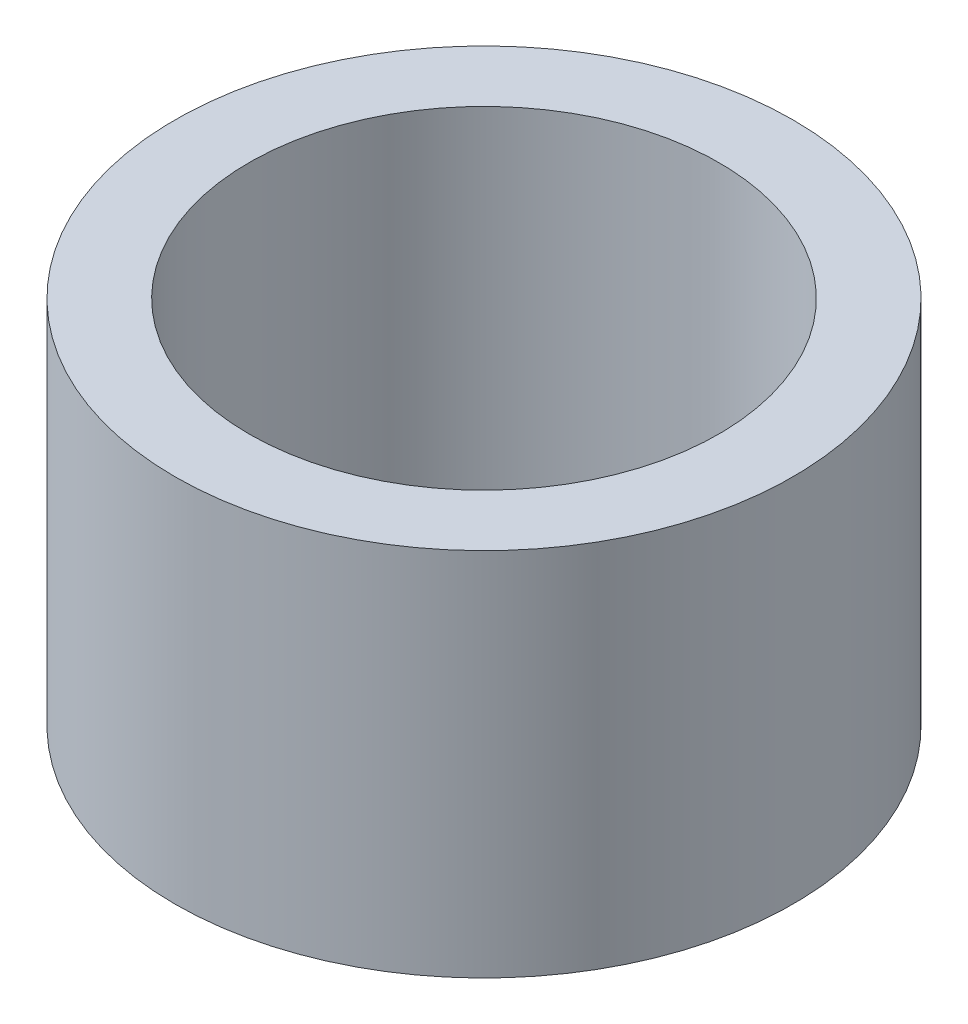
ISO-10303-21;
HEADER;
FILE_DESCRIPTION(('STEP AP214'),'2;1');
FILE_NAME('part.step','',(''),(''),'','','');
FILE_SCHEMA(('AUTOMOTIVE_DESIGN { 1 0 10303 214 1 1 1 1 }'));
ENDSEC;
DATA;
#1=APPLICATION_CONTEXT('core data for automotive mechanical design processes');
#2=APPLICATION_PROTOCOL_DEFINITION('international standard','automotive_design',2000,#1);
#3=PRODUCT_CONTEXT('',#1,'mechanical');
#4=PRODUCT('Part','Part','',(#3));
#5=PRODUCT_RELATED_PRODUCT_CATEGORY('part','',(#4));
#6=PRODUCT_DEFINITION_FORMATION('','',#4);
#7=PRODUCT_DEFINITION_CONTEXT('part definition',#1,'design');
#8=PRODUCT_DEFINITION('design','',#6,#7);
#9=PRODUCT_DEFINITION_SHAPE('','',#8);
#10=(LENGTH_UNIT() NAMED_UNIT(*) SI_UNIT(.MILLI.,.METRE.));
#11=(NAMED_UNIT(*) PLANE_ANGLE_UNIT() SI_UNIT($,.RADIAN.));
#12=(NAMED_UNIT(*) SI_UNIT($,.STERADIAN.) SOLID_ANGLE_UNIT());
#13=UNCERTAINTY_MEASURE_WITH_UNIT(LENGTH_MEASURE(1.E-05),#10,'distance_accuracy_value','');
#14=(GEOMETRIC_REPRESENTATION_CONTEXT(3) GLOBAL_UNCERTAINTY_ASSIGNED_CONTEXT((#13)) GLOBAL_UNIT_ASSIGNED_CONTEXT((#10,
#11,#12)) REPRESENTATION_CONTEXT('',''));
#15=CARTESIAN_POINT('',(0.,0.,0.));
#16=DIRECTION('',(0.,0.,1.));
#17=DIRECTION('',(1.,0.,0.));
#18=AXIS2_PLACEMENT_3D('',#15,#16,#17);
#19=CARTESIAN_POINT('',(0.,2.54,0.));
#20=DIRECTION('',(0.,1.,0.));
#21=DIRECTION('',(0.,0.,1.));
#22=AXIS2_PLACEMENT_3D('',#19,#20,#21);
#23=PLANE('',#22);
#24=CARTESIAN_POINT('',(0.,2.54,0.));
#25=DIRECTION('',(0.,1.,0.));
#26=DIRECTION('',(0.,0.,1.));
#27=AXIS2_PLACEMENT_3D('',#24,#25,#26);
#28=CIRCLE('',#27,2.1209);
#29=CARTESIAN_POINT('',(0.,2.54,2.1209));
#30=VERTEX_POINT('',#29);
#31=EDGE_CURVE('E10',#30,#30,#28,.T.);
#32=ORIENTED_EDGE('',*,*,#31,.T.);
#33=EDGE_LOOP('',(#32));
#34=FACE_BOUND('',#33,.T.);
#35=CARTESIAN_POINT('',(0.,2.54,0.));
#36=DIRECTION('',(0.,1.,0.));
#37=DIRECTION('',(0.,0.,1.));
#38=AXIS2_PLACEMENT_3D('',#35,#36,#37);
#39=CIRCLE('',#38,1.6129);
#40=CARTESIAN_POINT('',(0.,2.54,1.6129));
#41=VERTEX_POINT('',#40);
#42=EDGE_CURVE('E43',#41,#41,#39,.T.);
#43=ORIENTED_EDGE('',*,*,#42,.F.);
#44=EDGE_LOOP('',(#43));
#45=FACE_BOUND('',#44,.T.);
#46=ADVANCED_FACE('F32',(#34,#45),#23,.T.);
#47=CARTESIAN_POINT('',(0.,0.,0.));
#48=DIRECTION('',(0.,1.,0.));
#49=DIRECTION('',(0.,0.,1.));
#50=AXIS2_PLACEMENT_3D('',#47,#48,#49);
#51=PLANE('',#50);
#52=CARTESIAN_POINT('',(0.,0.,0.));
#53=DIRECTION('',(0.,1.,0.));
#54=DIRECTION('',(0.,0.,1.));
#55=AXIS2_PLACEMENT_3D('',#52,#53,#54);
#56=CIRCLE('',#55,2.1209);
#57=CARTESIAN_POINT('',(0.,0.,2.1209));
#58=VERTEX_POINT('',#57);
#59=EDGE_CURVE('E36',#58,#58,#56,.T.);
#60=ORIENTED_EDGE('',*,*,#59,.F.);
#61=EDGE_LOOP('',(#60));
#62=FACE_BOUND('',#61,.T.);
#63=CARTESIAN_POINT('',(0.,0.,0.));
#64=DIRECTION('',(0.,1.,0.));
#65=DIRECTION('',(0.,0.,1.));
#66=AXIS2_PLACEMENT_3D('',#63,#64,#65);
#67=CIRCLE('',#66,1.6129);
#68=CARTESIAN_POINT('',(0.,0.,1.6129));
#69=VERTEX_POINT('',#68);
#70=EDGE_CURVE('E45',#69,#69,#67,.T.);
#71=ORIENTED_EDGE('',*,*,#70,.T.);
#72=EDGE_LOOP('',(#71));
#73=FACE_BOUND('',#72,.T.);
#74=ADVANCED_FACE('F55',(#62,#73),#51,.F.);
#75=CARTESIAN_POINT('',(0.,2.54,0.));
#76=DIRECTION('',(0.,-1.,0.));
#77=DIRECTION('',(0.,0.,-1.));
#78=AXIS2_PLACEMENT_3D('',#75,#76,#77);
#79=CYLINDRICAL_SURFACE('',#78,2.1209);
#80=ORIENTED_EDGE('',*,*,#31,.F.);
#81=EDGE_LOOP('',(#80));
#82=FACE_BOUND('',#81,.T.);
#83=ORIENTED_EDGE('',*,*,#59,.T.);
#84=EDGE_LOOP('',(#83));
#85=FACE_BOUND('',#84,.T.);
#86=ADVANCED_FACE('F34',(#82,#85),#79,.T.);
#87=CARTESIAN_POINT('',(0.,2.54,0.));
#88=DIRECTION('',(0.,-1.,0.));
#89=DIRECTION('',(0.,0.,-1.));
#90=AXIS2_PLACEMENT_3D('',#87,#88,#89);
#91=CYLINDRICAL_SURFACE('',#90,1.6129);
#92=ORIENTED_EDGE('',*,*,#42,.T.);
#93=EDGE_LOOP('',(#92));
#94=FACE_BOUND('',#93,.T.);
#95=ORIENTED_EDGE('',*,*,#70,.F.);
#96=EDGE_LOOP('',(#95));
#97=FACE_BOUND('',#96,.T.);
#98=ADVANCED_FACE('F51',(#94,#97),#91,.F.);
#99=CLOSED_SHELL('',(#46,#74,#86,#98));
#100=MANIFOLD_SOLID_BREP('B2',#99);
#101=ADVANCED_BREP_SHAPE_REPRESENTATION('',(#18,#100),#14);
#102=SHAPE_DEFINITION_REPRESENTATION(#9,#101);
ENDSEC;
END-ISO-10303-21;
